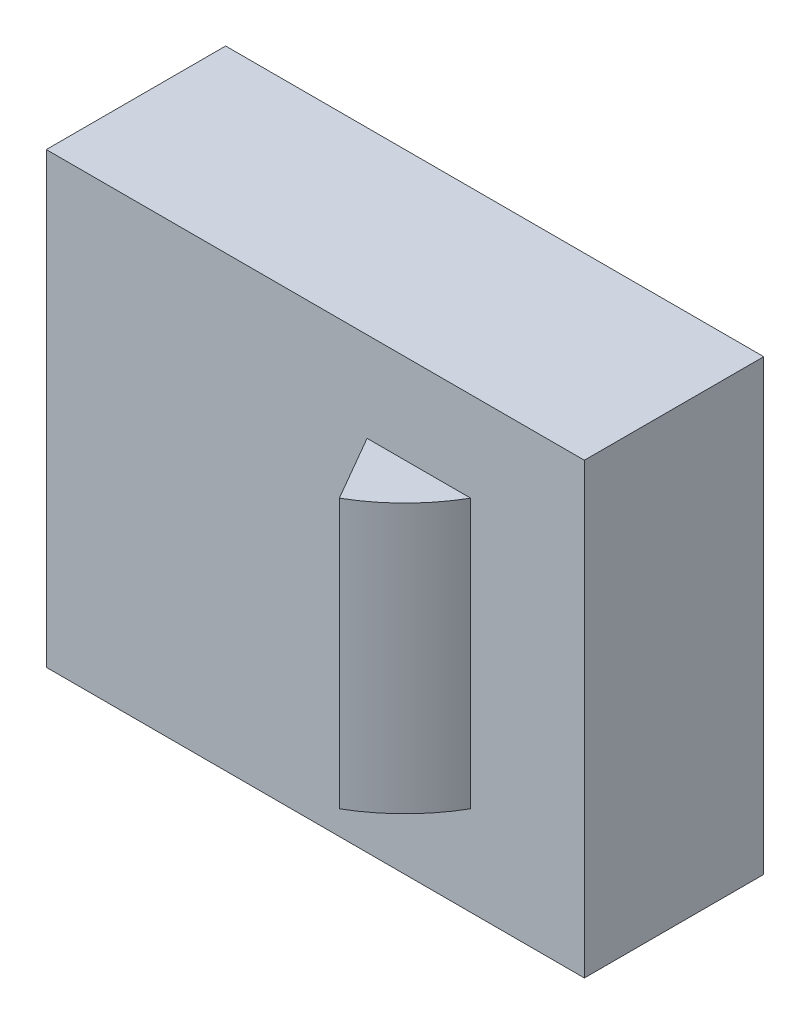
ISO-10303-21;
HEADER;
FILE_DESCRIPTION(('STEP AP214'),'2;1');
FILE_NAME('part.step','',(''),(''),'','','');
FILE_SCHEMA(('AUTOMOTIVE_DESIGN { 1 0 10303 214 1 1 1 1 }'));
ENDSEC;
DATA;
#1=APPLICATION_CONTEXT('core data for automotive mechanical design processes');
#2=APPLICATION_PROTOCOL_DEFINITION('international standard','automotive_design',2000,#1);
#3=PRODUCT_CONTEXT('',#1,'mechanical');
#4=PRODUCT('Part','Part','',(#3));
#5=PRODUCT_RELATED_PRODUCT_CATEGORY('part','',(#4));
#6=PRODUCT_DEFINITION_FORMATION('','',#4);
#7=PRODUCT_DEFINITION_CONTEXT('part definition',#1,'design');
#8=PRODUCT_DEFINITION('design','',#6,#7);
#9=PRODUCT_DEFINITION_SHAPE('','',#8);
#10=(LENGTH_UNIT() NAMED_UNIT(*) SI_UNIT(.MILLI.,.METRE.));
#11=(NAMED_UNIT(*) PLANE_ANGLE_UNIT() SI_UNIT($,.RADIAN.));
#12=(NAMED_UNIT(*) SI_UNIT($,.STERADIAN.) SOLID_ANGLE_UNIT());
#13=UNCERTAINTY_MEASURE_WITH_UNIT(LENGTH_MEASURE(1.E-05),#10,'distance_accuracy_value','');
#14=(GEOMETRIC_REPRESENTATION_CONTEXT(3) GLOBAL_UNCERTAINTY_ASSIGNED_CONTEXT((#13)) GLOBAL_UNIT_ASSIGNED_CONTEXT((#10,
#11,#12)) REPRESENTATION_CONTEXT('',''));
#15=CARTESIAN_POINT('',(0.,0.,0.));
#16=DIRECTION('',(0.,0.,1.));
#17=DIRECTION('',(1.,0.,0.));
#18=AXIS2_PLACEMENT_3D('',#15,#16,#17);
#19=CARTESIAN_POINT('',(-30.,40.,10.));
#20=DIRECTION('',(1.,0.,0.));
#21=DIRECTION('',(0.,0.,-1.));
#22=AXIS2_PLACEMENT_3D('',#19,#20,#21);
#23=PLANE('',#22);
#24=DIRECTION('',(0.,-1.,0.));
#25=VECTOR('',#24,1.);
#26=CARTESIAN_POINT('',(-30.,40.,-10.));
#27=LINE('',#26,#25);
#28=CARTESIAN_POINT('',(-30.,40.,-10.));
#29=VERTEX_POINT('',#28);
#30=CARTESIAN_POINT('',(-30.,-10.,-10.));
#31=VERTEX_POINT('',#30);
#32=EDGE_CURVE('E153',#29,#31,#27,.T.);
#33=ORIENTED_EDGE('',*,*,#32,.T.);
#34=DIRECTION('',(0.,0.,-1.));
#35=VECTOR('',#34,1.);
#36=CARTESIAN_POINT('',(-30.,-10.,10.));
#37=LINE('',#36,#35);
#38=CARTESIAN_POINT('',(-30.,-10.,10.));
#39=VERTEX_POINT('',#38);
#40=EDGE_CURVE('E180',#39,#31,#37,.T.);
#41=ORIENTED_EDGE('',*,*,#40,.F.);
#42=DIRECTION('',(0.,-1.,0.));
#43=VECTOR('',#42,1.);
#44=CARTESIAN_POINT('',(-30.,40.,10.));
#45=LINE('',#44,#43);
#46=CARTESIAN_POINT('',(-30.,40.,10.));
#47=VERTEX_POINT('',#46);
#48=EDGE_CURVE('E154',#47,#39,#45,.T.);
#49=ORIENTED_EDGE('',*,*,#48,.F.);
#50=DIRECTION('',(0.,0.,-1.));
#51=VECTOR('',#50,1.);
#52=CARTESIAN_POINT('',(-30.,40.,10.));
#53=LINE('',#52,#51);
#54=EDGE_CURVE('E164',#47,#29,#53,.T.);
#55=ORIENTED_EDGE('',*,*,#54,.T.);
#56=EDGE_LOOP('',(#33,#41,#49,#55));
#57=FACE_BOUND('',#56,.T.);
#58=ADVANCED_FACE('F41',(#57),#23,.F.);
#59=CARTESIAN_POINT('',(-30.,-10.,10.));
#60=DIRECTION('',(0.,1.,0.));
#61=DIRECTION('',(0.,0.,1.));
#62=AXIS2_PLACEMENT_3D('',#59,#60,#61);
#63=PLANE('',#62);
#64=DIRECTION('',(1.,0.,0.));
#65=VECTOR('',#64,1.);
#66=CARTESIAN_POINT('',(-30.,-10.,-10.));
#67=LINE('',#66,#65);
#68=CARTESIAN_POINT('',(30.,-10.,-10.));
#69=VERTEX_POINT('',#68);
#70=EDGE_CURVE('E167',#31,#69,#67,.T.);
#71=ORIENTED_EDGE('',*,*,#70,.T.);
#72=DIRECTION('',(0.,0.,-1.));
#73=VECTOR('',#72,1.);
#74=CARTESIAN_POINT('',(30.,-10.,10.));
#75=LINE('',#74,#73);
#76=CARTESIAN_POINT('',(30.,-10.,10.));
#77=VERTEX_POINT('',#76);
#78=EDGE_CURVE('E177',#77,#69,#75,.T.);
#79=ORIENTED_EDGE('',*,*,#78,.F.);
#80=DIRECTION('',(1.,0.,0.));
#81=VECTOR('',#80,1.);
#82=CARTESIAN_POINT('',(-30.,-10.,10.));
#83=LINE('',#82,#81);
#84=EDGE_CURVE('E157',#39,#77,#83,.T.);
#85=ORIENTED_EDGE('',*,*,#84,.F.);
#86=ORIENTED_EDGE('',*,*,#40,.T.);
#87=EDGE_LOOP('',(#71,#79,#85,#86));
#88=FACE_BOUND('',#87,.T.);
#89=ADVANCED_FACE('F219',(#88),#63,.F.);
#90=CARTESIAN_POINT('',(30.,-10.,10.));
#91=DIRECTION('',(-1.,0.,0.));
#92=DIRECTION('',(0.,0.,1.));
#93=AXIS2_PLACEMENT_3D('',#90,#91,#92);
#94=PLANE('',#93);
#95=DIRECTION('',(0.,1.,0.));
#96=VECTOR('',#95,1.);
#97=CARTESIAN_POINT('',(30.,-10.,-10.));
#98=LINE('',#97,#96);
#99=CARTESIAN_POINT('',(30.,40.,-10.));
#100=VERTEX_POINT('',#99);
#101=EDGE_CURVE('E169',#69,#100,#98,.T.);
#102=ORIENTED_EDGE('',*,*,#101,.T.);
#103=DIRECTION('',(0.,0.,-1.));
#104=VECTOR('',#103,1.);
#105=CARTESIAN_POINT('',(30.,40.,10.));
#106=LINE('',#105,#104);
#107=CARTESIAN_POINT('',(30.,40.,10.));
#108=VERTEX_POINT('',#107);
#109=EDGE_CURVE('E174',#108,#100,#106,.T.);
#110=ORIENTED_EDGE('',*,*,#109,.F.);
#111=DIRECTION('',(0.,1.,0.));
#112=VECTOR('',#111,1.);
#113=CARTESIAN_POINT('',(30.,-10.,10.));
#114=LINE('',#113,#112);
#115=EDGE_CURVE('E160',#77,#108,#114,.T.);
#116=ORIENTED_EDGE('',*,*,#115,.F.);
#117=ORIENTED_EDGE('',*,*,#78,.T.);
#118=EDGE_LOOP('',(#102,#110,#116,#117));
#119=FACE_BOUND('',#118,.T.);
#120=ADVANCED_FACE('F224',(#119),#94,.F.);
#121=CARTESIAN_POINT('',(30.,40.,10.));
#122=DIRECTION('',(0.,-1.,0.));
#123=DIRECTION('',(0.,0.,-1.));
#124=AXIS2_PLACEMENT_3D('',#121,#122,#123);
#125=PLANE('',#124);
#126=DIRECTION('',(-1.,0.,0.));
#127=VECTOR('',#126,1.);
#128=CARTESIAN_POINT('',(30.,40.,-10.));
#129=LINE('',#128,#127);
#130=EDGE_CURVE('E158',#100,#29,#129,.T.);
#131=ORIENTED_EDGE('',*,*,#130,.T.);
#132=ORIENTED_EDGE('',*,*,#54,.F.);
#133=DIRECTION('',(-1.,0.,0.));
#134=VECTOR('',#133,1.);
#135=CARTESIAN_POINT('',(30.,40.,10.));
#136=LINE('',#135,#134);
#137=EDGE_CURVE('E162',#108,#47,#136,.T.);
#138=ORIENTED_EDGE('',*,*,#137,.F.);
#139=ORIENTED_EDGE('',*,*,#109,.T.);
#140=EDGE_LOOP('',(#131,#132,#138,#139));
#141=FACE_BOUND('',#140,.T.);
#142=ADVANCED_FACE('F239',(#141),#125,.F.);
#143=CARTESIAN_POINT('',(0.,0.,10.));
#144=DIRECTION('',(0.,0.,1.));
#145=DIRECTION('',(1.,0.,0.));
#146=AXIS2_PLACEMENT_3D('',#143,#144,#145);
#147=PLANE('',#146);
#148=DIRECTION('',(1.,0.,0.));
#149=VECTOR('',#148,1.);
#150=CARTESIAN_POINT('',(0.,0.,10.));
#151=LINE('',#150,#149);
#152=CARTESIAN_POINT('',(5.77350269189626,0.,10.));
#153=VERTEX_POINT('',#152);
#154=CARTESIAN_POINT('',(17.3205080756888,0.,10.));
#155=VERTEX_POINT('',#154);
#156=EDGE_CURVE('E127',#153,#155,#151,.T.);
#157=ORIENTED_EDGE('',*,*,#156,.F.);
#158=DIRECTION('',(0.,-1.,0.));
#159=VECTOR('',#158,1.);
#160=CARTESIAN_POINT('',(5.77350269189626,0.,10.));
#161=LINE('',#160,#159);
#162=CARTESIAN_POINT('',(5.77350269189626,30.,10.));
#163=VERTEX_POINT('',#162);
#164=EDGE_CURVE('E11',#163,#153,#161,.T.);
#165=ORIENTED_EDGE('',*,*,#164,.F.);
#166=DIRECTION('',(-1.,0.,0.));
#167=VECTOR('',#166,1.);
#168=CARTESIAN_POINT('',(0.,30.,10.));
#169=LINE('',#168,#167);
#170=CARTESIAN_POINT('',(17.3205080756888,30.,10.));
#171=VERTEX_POINT('',#170);
#172=EDGE_CURVE('E60',#171,#163,#169,.T.);
#173=ORIENTED_EDGE('',*,*,#172,.F.);
#174=DIRECTION('',(0.,-1.,0.));
#175=VECTOR('',#174,1.);
#176=CARTESIAN_POINT('',(17.3205080756888,0.,10.));
#177=LINE('',#176,#175);
#178=EDGE_CURVE('E55',#155,#171,#177,.F.);
#179=ORIENTED_EDGE('',*,*,#178,.F.);
#180=EDGE_LOOP('',(#157,#165,#173,#179));
#181=FACE_BOUND('',#180,.T.);
#182=ORIENTED_EDGE('',*,*,#48,.T.);
#183=ORIENTED_EDGE('',*,*,#84,.T.);
#184=ORIENTED_EDGE('',*,*,#115,.T.);
#185=ORIENTED_EDGE('',*,*,#137,.T.);
#186=EDGE_LOOP('',(#182,#183,#184,#185));
#187=FACE_BOUND('',#186,.T.);
#188=ADVANCED_FACE('F235',(#181,#187),#147,.T.);
#189=CARTESIAN_POINT('',(0.,0.,-10.));
#190=DIRECTION('',(0.,0.,1.));
#191=DIRECTION('',(1.,0.,0.));
#192=AXIS2_PLACEMENT_3D('',#189,#190,#191);
#193=PLANE('',#192);
#194=DIRECTION('',(0.,1.,0.));
#195=VECTOR('',#194,1.);
#196=CARTESIAN_POINT('',(5.77350269189626,0.,-10.));
#197=LINE('',#196,#195);
#198=CARTESIAN_POINT('',(5.77350269189626,0.,-10.));
#199=VERTEX_POINT('',#198);
#200=CARTESIAN_POINT('',(5.77350269189626,30.,-10.));
#201=VERTEX_POINT('',#200);
#202=EDGE_CURVE('E183',#199,#201,#197,.T.);
#203=ORIENTED_EDGE('',*,*,#202,.F.);
#204=DIRECTION('',(1.,0.,0.));
#205=VECTOR('',#204,1.);
#206=CARTESIAN_POINT('',(0.,0.,-10.));
#207=LINE('',#206,#205);
#208=CARTESIAN_POINT('',(17.3205080756888,0.,-10.));
#209=VERTEX_POINT('',#208);
#210=EDGE_CURVE('E48',#199,#209,#207,.T.);
#211=ORIENTED_EDGE('',*,*,#210,.T.);
#212=DIRECTION('',(0.,-1.,0.));
#213=VECTOR('',#212,1.);
#214=CARTESIAN_POINT('',(17.3205080756888,0.,-10.));
#215=LINE('',#214,#213);
#216=CARTESIAN_POINT('',(17.3205080756888,30.,-10.));
#217=VERTEX_POINT('',#216);
#218=EDGE_CURVE('E188',#209,#217,#215,.F.);
#219=ORIENTED_EDGE('',*,*,#218,.T.);
#220=DIRECTION('',(-1.,0.,0.));
#221=VECTOR('',#220,1.);
#222=CARTESIAN_POINT('',(0.,30.,-10.));
#223=LINE('',#222,#221);
#224=EDGE_CURVE('E186',#217,#201,#223,.T.);
#225=ORIENTED_EDGE('',*,*,#224,.T.);
#226=EDGE_LOOP('',(#203,#211,#219,#225));
#227=FACE_BOUND('',#226,.T.);
#228=ORIENTED_EDGE('',*,*,#32,.F.);
#229=ORIENTED_EDGE('',*,*,#130,.F.);
#230=ORIENTED_EDGE('',*,*,#101,.F.);
#231=ORIENTED_EDGE('',*,*,#70,.F.);
#232=EDGE_LOOP('',(#228,#229,#230,#231));
#233=FACE_BOUND('',#232,.T.);
#234=ADVANCED_FACE('F192',(#227,#233),#193,.F.);
#235=CARTESIAN_POINT('',(0.,0.,0.));
#236=DIRECTION('',(0.866025403784439,0.,0.5));
#237=DIRECTION('',(0.5,0.,-0.866025403784439));
#238=AXIS2_PLACEMENT_3D('',#235,#236,#237);
#239=PLANE('',#238);
#240=DIRECTION('',(0.5,0.,-0.866025403784439));
#241=VECTOR('',#240,1.);
#242=CARTESIAN_POINT('',(2.5,0.,-4.33012701892219));
#243=LINE('',#242,#241);
#244=CARTESIAN_POINT('',(10.,0.,-17.3205080756888));
#245=VERTEX_POINT('',#244);
#246=EDGE_CURVE('E137',#199,#245,#243,.T.);
#247=ORIENTED_EDGE('',*,*,#246,.F.);
#248=ORIENTED_EDGE('',*,*,#202,.T.);
#249=DIRECTION('',(-0.5,0.,0.866025403784439));
#250=VECTOR('',#249,1.);
#251=CARTESIAN_POINT('',(10.,30.,-17.3205080756888));
#252=LINE('',#251,#250);
#253=CARTESIAN_POINT('',(10.,30.,-17.3205080756888));
#254=VERTEX_POINT('',#253);
#255=EDGE_CURVE('E144',#254,#201,#252,.T.);
#256=ORIENTED_EDGE('',*,*,#255,.F.);
#257=DIRECTION('',(0.,1.,0.));
#258=VECTOR('',#257,1.);
#259=CARTESIAN_POINT('',(10.,0.,-17.3205080756888));
#260=LINE('',#259,#258);
#261=EDGE_CURVE('E141',#245,#254,#260,.T.);
#262=ORIENTED_EDGE('',*,*,#261,.F.);
#263=EDGE_LOOP('',(#247,#248,#256,#262));
#264=FACE_BOUND('',#263,.T.);
#265=ADVANCED_FACE('F203',(#264),#239,.F.);
#266=CARTESIAN_POINT('',(10.,30.,-17.3205080756888));
#267=DIRECTION('',(0.,1.,0.));
#268=DIRECTION('',(0.,0.,1.));
#269=AXIS2_PLACEMENT_3D('',#266,#267,#268);
#270=PLANE('',#269);
#271=ORIENTED_EDGE('',*,*,#224,.F.);
#272=CARTESIAN_POINT('',(0.,30.,0.));
#273=DIRECTION('',(0.,-1.,0.));
#274=DIRECTION('',(0.,0.,-1.));
#275=AXIS2_PLACEMENT_3D('',#272,#273,#274);
#276=CIRCLE('',#275,20.);
#277=EDGE_CURVE('E130',#254,#217,#276,.T.);
#278=ORIENTED_EDGE('',*,*,#277,.F.);
#279=ORIENTED_EDGE('',*,*,#255,.T.);
#280=EDGE_LOOP('',(#271,#278,#279));
#281=FACE_BOUND('',#280,.T.);
#282=ADVANCED_FACE('F206',(#281),#270,.T.);
#283=CARTESIAN_POINT('',(0.,0.,0.));
#284=DIRECTION('',(0.,-1.,0.));
#285=DIRECTION('',(0.,0.,-1.));
#286=AXIS2_PLACEMENT_3D('',#283,#284,#285);
#287=CYLINDRICAL_SURFACE('',#286,20.);
#288=ORIENTED_EDGE('',*,*,#218,.F.);
#289=CARTESIAN_POINT('',(0.,0.,0.));
#290=DIRECTION('',(0.,-1.,0.));
#291=DIRECTION('',(0.,0.,-1.));
#292=AXIS2_PLACEMENT_3D('',#289,#290,#291);
#293=CIRCLE('',#292,20.);
#294=EDGE_CURVE('E129',#245,#209,#293,.T.);
#295=ORIENTED_EDGE('',*,*,#294,.F.);
#296=ORIENTED_EDGE('',*,*,#261,.T.);
#297=ORIENTED_EDGE('',*,*,#277,.T.);
#298=EDGE_LOOP('',(#288,#295,#296,#297));
#299=FACE_BOUND('',#298,.T.);
#300=ADVANCED_FACE('F199',(#299),#287,.T.);
#301=CARTESIAN_POINT('',(2.5,0.,-4.33012701892219));
#302=DIRECTION('',(0.,-1.,0.));
#303=DIRECTION('',(0.,0.,-1.));
#304=AXIS2_PLACEMENT_3D('',#301,#302,#303);
#305=PLANE('',#304);
#306=ORIENTED_EDGE('',*,*,#210,.F.);
#307=ORIENTED_EDGE('',*,*,#246,.T.);
#308=ORIENTED_EDGE('',*,*,#294,.T.);
#309=EDGE_LOOP('',(#306,#307,#308));
#310=FACE_BOUND('',#309,.T.);
#311=ADVANCED_FACE('F201',(#310),#305,.T.);
#312=DIRECTION('',(0.5,0.,0.866025403784439));
#313=VECTOR('',#312,1.);
#314=CARTESIAN_POINT('',(2.5,0.,4.33012701892219));
#315=LINE('',#314,#313);
#316=CARTESIAN_POINT('',(10.,0.,17.3205080756888));
#317=VERTEX_POINT('',#316);
#318=EDGE_CURVE('E115',#153,#317,#315,.T.);
#319=ORIENTED_EDGE('',*,*,#318,.F.);
#320=ORIENTED_EDGE('',*,*,#156,.T.);
#321=EDGE_CURVE('E125',#155,#317,#293,.T.);
#322=ORIENTED_EDGE('',*,*,#321,.T.);
#323=EDGE_LOOP('',(#319,#320,#322));
#324=FACE_BOUND('',#323,.T.);
#325=ADVANCED_FACE('F126',(#324),#305,.T.);
#326=ORIENTED_EDGE('',*,*,#321,.F.);
#327=ORIENTED_EDGE('',*,*,#178,.T.);
#328=CARTESIAN_POINT('',(10.,30.,17.3205080756888));
#329=VERTEX_POINT('',#328);
#330=EDGE_CURVE('E134',#171,#329,#276,.T.);
#331=ORIENTED_EDGE('',*,*,#330,.T.);
#332=DIRECTION('',(0.,1.,0.));
#333=VECTOR('',#332,1.);
#334=CARTESIAN_POINT('',(10.,0.,17.3205080756888));
#335=LINE('',#334,#333);
#336=EDGE_CURVE('E120',#317,#329,#335,.T.);
#337=ORIENTED_EDGE('',*,*,#336,.F.);
#338=EDGE_LOOP('',(#326,#327,#331,#337));
#339=FACE_BOUND('',#338,.T.);
#340=ADVANCED_FACE('F132',(#339),#287,.T.);
#341=ORIENTED_EDGE('',*,*,#330,.F.);
#342=ORIENTED_EDGE('',*,*,#172,.T.);
#343=DIRECTION('',(-0.5,0.,-0.866025403784439));
#344=VECTOR('',#343,1.);
#345=CARTESIAN_POINT('',(10.,30.,17.3205080756888));
#346=LINE('',#345,#344);
#347=EDGE_CURVE('E135',#329,#163,#346,.T.);
#348=ORIENTED_EDGE('',*,*,#347,.F.);
#349=EDGE_LOOP('',(#341,#342,#348));
#350=FACE_BOUND('',#349,.T.);
#351=ADVANCED_FACE('F209',(#350),#270,.T.);
#352=CARTESIAN_POINT('',(0.,0.,0.));
#353=DIRECTION('',(-0.866025403784439,0.,0.5));
#354=DIRECTION('',(0.5,0.,0.866025403784439));
#355=AXIS2_PLACEMENT_3D('',#352,#353,#354);
#356=PLANE('',#355);
#357=ORIENTED_EDGE('',*,*,#347,.T.);
#358=ORIENTED_EDGE('',*,*,#164,.T.);
#359=ORIENTED_EDGE('',*,*,#318,.T.);
#360=ORIENTED_EDGE('',*,*,#336,.T.);
#361=EDGE_LOOP('',(#357,#358,#359,#360));
#362=FACE_BOUND('',#361,.T.);
#363=ADVANCED_FACE('F118',(#362),#356,.T.);
#364=CLOSED_SHELL('',(#58,#89,#120,#142,#188,#234,#265,#282,#300,#311,#325,#340,#351,#363));
#365=MANIFOLD_SOLID_BREP('B2',#364);
#366=ADVANCED_BREP_SHAPE_REPRESENTATION('',(#18,#365),#14);
#367=SHAPE_DEFINITION_REPRESENTATION(#9,#366);
ENDSEC;
END-ISO-10303-21;
